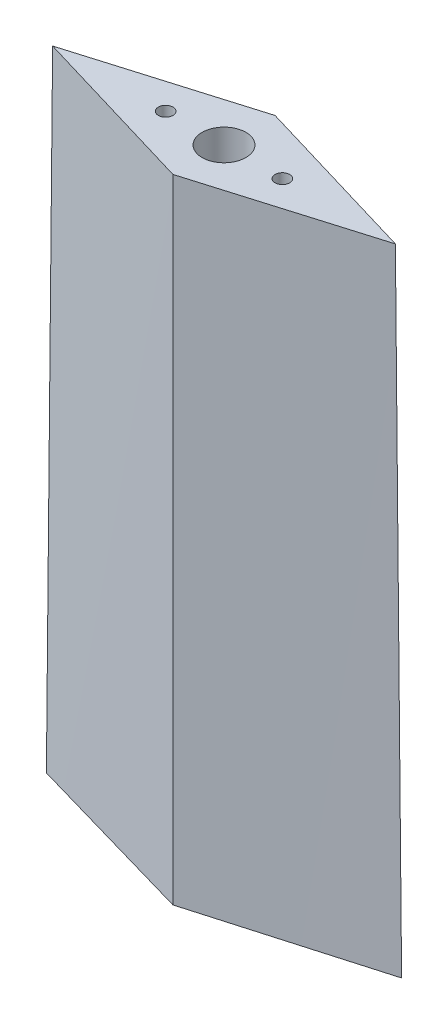
ISO-10303-21;
HEADER;
FILE_DESCRIPTION(('STEP AP214'),'2;1');
FILE_NAME('part.step','',(''),(''),'','','');
FILE_SCHEMA(('AUTOMOTIVE_DESIGN { 1 0 10303 214 1 1 1 1 }'));
ENDSEC;
DATA;
#1=APPLICATION_CONTEXT('core data for automotive mechanical design processes');
#2=APPLICATION_PROTOCOL_DEFINITION('international standard','automotive_design',2000,#1);
#3=PRODUCT_CONTEXT('',#1,'mechanical');
#4=PRODUCT('Part','Part','',(#3));
#5=PRODUCT_RELATED_PRODUCT_CATEGORY('part','',(#4));
#6=PRODUCT_DEFINITION_FORMATION('','',#4);
#7=PRODUCT_DEFINITION_CONTEXT('part definition',#1,'design');
#8=PRODUCT_DEFINITION('design','',#6,#7);
#9=PRODUCT_DEFINITION_SHAPE('','',#8);
#10=(LENGTH_UNIT() NAMED_UNIT(*) SI_UNIT(.MILLI.,.METRE.));
#11=(NAMED_UNIT(*) PLANE_ANGLE_UNIT() SI_UNIT($,.RADIAN.));
#12=(NAMED_UNIT(*) SI_UNIT($,.STERADIAN.) SOLID_ANGLE_UNIT());
#13=UNCERTAINTY_MEASURE_WITH_UNIT(LENGTH_MEASURE(1.E-05),#10,'distance_accuracy_value','');
#14=(GEOMETRIC_REPRESENTATION_CONTEXT(3) GLOBAL_UNCERTAINTY_ASSIGNED_CONTEXT((#13)) GLOBAL_UNIT_ASSIGNED_CONTEXT((#10,
#11,#12)) REPRESENTATION_CONTEXT('',''));
#15=CARTESIAN_POINT('',(0.,0.,0.));
#16=DIRECTION('',(0.,0.,1.));
#17=DIRECTION('',(1.,0.,0.));
#18=AXIS2_PLACEMENT_3D('',#15,#16,#17);
#19=CARTESIAN_POINT('',(142.421230690097,465.168027231046,-11.1125));
#20=DIRECTION('',(0.,-1.,0.));
#21=DIRECTION('',(0.,0.,-1.));
#22=AXIS2_PLACEMENT_3D('',#19,#20,#21);
#23=PLANE('',#22);
#24=CARTESIAN_POINT('',(193.768628680817,465.168027231046,0.));
#25=DIRECTION('',(0.,-1.,0.));
#26=DIRECTION('',(0.,0.,-1.));
#27=AXIS2_PLACEMENT_3D('',#24,#25,#26);
#28=CIRCLE('',#27,1.58749999999999);
#29=CARTESIAN_POINT('',(193.768628680817,465.168027231046,-1.58749999999999));
#30=VERTEX_POINT('',#29);
#31=EDGE_CURVE('E219',#30,#30,#28,.T.);
#32=ORIENTED_EDGE('',*,*,#31,.F.);
#33=EDGE_LOOP('',(#32));
#34=FACE_BOUND('',#33,.T.);
#35=CARTESIAN_POINT('',(168.368628680817,465.168027231046,0.));
#36=DIRECTION('',(0.,-1.,0.));
#37=DIRECTION('',(0.,0.,-1.));
#38=AXIS2_PLACEMENT_3D('',#35,#36,#37);
#39=CIRCLE('',#38,1.58749999999999);
#40=CARTESIAN_POINT('',(168.368628680817,465.168027231046,-1.58749999999999));
#41=VERTEX_POINT('',#40);
#42=EDGE_CURVE('E223',#41,#41,#39,.T.);
#43=ORIENTED_EDGE('',*,*,#42,.F.);
#44=EDGE_LOOP('',(#43));
#45=FACE_BOUND('',#44,.T.);
#46=CARTESIAN_POINT('',(181.068628680817,465.168027231046,0.));
#47=DIRECTION('',(0.,-1.,0.));
#48=DIRECTION('',(0.,0.,-1.));
#49=AXIS2_PLACEMENT_3D('',#46,#47,#48);
#50=CIRCLE('',#49,4.76250000000001);
#51=CARTESIAN_POINT('',(181.068628680817,465.168027231046,-4.76250000000001));
#52=VERTEX_POINT('',#51);
#53=EDGE_CURVE('E145',#52,#52,#50,.T.);
#54=ORIENTED_EDGE('',*,*,#53,.F.);
#55=EDGE_LOOP('',(#54));
#56=FACE_BOUND('',#55,.T.);
#57=DIRECTION('',(0.96106023622245,0.,0.276338962783115));
#58=VECTOR('',#57,1.);
#59=CARTESIAN_POINT('',(181.068628680817,465.168027231046,-11.1125));
#60=LINE('',#59,#58);
#61=CARTESIAN_POINT('',(181.068628680817,465.168027231046,-11.1125));
#62=VERTEX_POINT('',#61);
#63=CARTESIAN_POINT('',(219.716026671538,465.168027231046,0.));
#64=VERTEX_POINT('',#63);
#65=EDGE_CURVE('E120',#62,#64,#60,.T.);
#66=ORIENTED_EDGE('',*,*,#65,.T.);
#67=DIRECTION('',(0.96106023622245,0.,-0.276338962783115));
#68=VECTOR('',#67,1.);
#69=CARTESIAN_POINT('',(181.068628680817,465.168027231046,11.1125));
#70=LINE('',#69,#68);
#71=CARTESIAN_POINT('',(181.068628680817,465.168027231046,11.1125));
#72=VERTEX_POINT('',#71);
#73=EDGE_CURVE('E69',#72,#64,#70,.T.);
#74=ORIENTED_EDGE('',*,*,#73,.F.);
#75=DIRECTION('',(0.96106023622245,0.,0.276338962783115));
#76=VECTOR('',#75,1.);
#77=CARTESIAN_POINT('',(142.421230690097,465.168027231046,0.));
#78=LINE('',#77,#76);
#79=CARTESIAN_POINT('',(142.421230690097,465.168027231046,0.));
#80=VERTEX_POINT('',#79);
#81=EDGE_CURVE('E12',#80,#72,#78,.T.);
#82=ORIENTED_EDGE('',*,*,#81,.F.);
#83=DIRECTION('',(0.96106023622245,0.,-0.276338962783115));
#84=VECTOR('',#83,1.);
#85=CARTESIAN_POINT('',(142.421230690097,465.168027231046,0.));
#86=LINE('',#85,#84);
#87=EDGE_CURVE('E116',#80,#62,#86,.T.);
#88=ORIENTED_EDGE('',*,*,#87,.T.);
#89=EDGE_LOOP('',(#66,#74,#82,#88));
#90=FACE_BOUND('',#89,.T.);
#91=ADVANCED_FACE('F61',(#34,#45,#56,#90),#23,.T.);
#92=CARTESIAN_POINT('',(219.716026671538,465.168027231046,0.));
#93=CARTESIAN_POINT('',(213.502471629307,1096.96763455169,0.));
#94=CARTESIAN_POINT('',(213.274793673085,465.168027231046,1.85208333333331));
#95=CARTESIAN_POINT('',(208.096831137892,1096.96763455169,1.85208333333331));
#96=CARTESIAN_POINT('',(206.833560674631,465.168027231046,3.70416666666664));
#97=CARTESIAN_POINT('',(202.691190646477,1096.96763455169,3.70416666666663));
#98=CARTESIAN_POINT('',(193.951094677724,465.168027231046,7.4083333333333));
#99=CARTESIAN_POINT('',(191.879909663647,1096.96763455169,7.4083333333333));
#100=CARTESIAN_POINT('',(187.509861679271,465.168027231046,9.26041666666665));
#101=CARTESIAN_POINT('',(186.474269172232,1096.96763455169,9.26041666666665));
#102=CARTESIAN_POINT('',(181.068628680817,465.168027231046,11.1125));
#103=CARTESIAN_POINT('',(181.068628680817,1096.96763455169,11.1125));
#104=B_SPLINE_SURFACE_WITH_KNOTS('',3,1,((#92,#93),(#94,#95),(#96,#97),(#98,#99),(#100,#101),
(#102,#103)),.UNSPECIFIED.,.F.,.F.,.F.,(4,2,4),(2,2),(0.,0.5,1.),(0.,1.),.UNSPECIFIED.);
#105=DIRECTION('',(-0.00983421721197636,0.99995164291671,0.));
#106=VECTOR('',#105,1.);
#107=CARTESIAN_POINT('',(219.716026671538,465.168027231046,0.));
#108=LINE('',#107,#106);
#109=CARTESIAN_POINT('',(218.362092496898,602.837215652406,0.));
#110=VERTEX_POINT('',#109);
#111=EDGE_CURVE('E118',#64,#110,#108,.T.);
#112=CARTESIAN_POINT('',(218.362092496898,602.837215652406,0.));
#113=CARTESIAN_POINT('',(215.15052846194,602.837215652406,0.956964081279098));
#114=CARTESIAN_POINT('',(211.938964426982,602.837215652406,1.9139281625582));
#115=CARTESIAN_POINT('',(205.515836357066,602.837215652406,3.82785632511641));
#116=CARTESIAN_POINT('',(202.304272322108,602.837215652406,4.78482040639551));
#117=CARTESIAN_POINT('',(193.084681751706,602.837215652406,7.53202299178308));
#118=CARTESIAN_POINT('',(187.076655216262,602.837215652406,9.32226149589155));
#119=CARTESIAN_POINT('',(181.068628680818,602.837215652406,11.1125));
#120=B_SPLINE_CURVE_WITH_KNOTS('',3,(#112,#113,#114,#115,#116,#117,#118,#119),.UNSPECIFIED.,.F.,
.F.,(4,2,2,4),(0.,10.0533235415682,20.1066470831364,38.9138805524626),.UNSPECIFIED.);
#121=CARTESIAN_POINT('',(181.068628680817,602.837215652406,11.1125));
#122=VERTEX_POINT('',#121);
#123=EDGE_CURVE('E112',#110,#122,#120,.T.);
#124=DIRECTION('',(0.,1.,0.));
#125=VECTOR('',#124,1.);
#126=CARTESIAN_POINT('',(181.068628680817,781.067830891368,11.1125));
#127=LINE('',#126,#125);
#128=EDGE_CURVE('E111',#72,#122,#127,.T.);
#129=ORIENTED_EDGE('',*,*,#111,.T.);
#130=ORIENTED_EDGE('',*,*,#123,.T.);
#131=ORIENTED_EDGE('',*,*,#128,.F.);
#132=ORIENTED_EDGE('',*,*,#73,.T.);
#133=EDGE_LOOP('',(#129,#130,#131,#132));
#134=FACE_BOUND('',#133,.T.);
#135=ADVANCED_FACE('F162',(#134),#104,.F.);
#136=CARTESIAN_POINT('',(181.068628680817,465.168027231046,11.1125));
#137=CARTESIAN_POINT('',(181.068628680817,1096.96763455169,11.1125));
#138=CARTESIAN_POINT('',(174.627395682364,465.168027231046,9.26041666666668));
#139=CARTESIAN_POINT('',(175.662988189402,1096.96763455169,9.26041666666663));
#140=CARTESIAN_POINT('',(168.186162683911,465.168027231046,7.40833333333335));
#141=CARTESIAN_POINT('',(170.257347697988,1096.96763455169,7.40833333333328));
#142=CARTESIAN_POINT('',(155.303696687004,465.168027231046,3.70416666666668));
#143=CARTESIAN_POINT('',(159.446066715158,1096.96763455169,3.70416666666661));
#144=CARTESIAN_POINT('',(148.86246368855,465.168027231046,1.85208333333334));
#145=CARTESIAN_POINT('',(154.040426223743,1096.96763455169,1.8520833333333));
#146=CARTESIAN_POINT('',(142.421230690097,465.168027231046,0.));
#147=CARTESIAN_POINT('',(148.634785732328,1096.96763455169,0.));
#148=B_SPLINE_SURFACE_WITH_KNOTS('',3,1,((#136,#137),(#138,#139),(#140,#141),(#142,#143),(#144,
#145),(#146,#147)),.UNSPECIFIED.,.F.,.F.,.F.,(4,2,4),(2,2),(0.,0.5,1.),(0.,1.),.UNSPECIFIED.);
#149=CARTESIAN_POINT('',(181.068628680817,602.837215652406,11.1125));
#150=CARTESIAN_POINT('',(177.857064645859,602.837215652406,10.1555359187209));
#151=CARTESIAN_POINT('',(174.645500610901,602.837215652406,9.19857183744178));
#152=CARTESIAN_POINT('',(168.222372540985,602.837215652406,7.28464367488359));
#153=CARTESIAN_POINT('',(165.010808506027,602.837215652406,6.3276795936045));
#154=CARTESIAN_POINT('',(155.791217935625,602.837215652406,3.58047700821695));
#155=CARTESIAN_POINT('',(149.783191400181,602.837215652406,1.79023850410849));
#156=CARTESIAN_POINT('',(143.775164864737,602.837215652406,0.));
#157=B_SPLINE_CURVE_WITH_KNOTS('',3,(#149,#150,#151,#152,#153,#154,#155,#156),.UNSPECIFIED.,.F.,
.F.,(4,2,2,4),(0.,10.0533235415681,20.1066470831362,38.9138805524626),.UNSPECIFIED.);
#158=CARTESIAN_POINT('',(143.775164864737,602.837215652406,0.));
#159=VERTEX_POINT('',#158);
#160=EDGE_CURVE('E103',#122,#159,#157,.T.);
#161=DIRECTION('',(0.00983421721197636,0.99995164291671,0.));
#162=VECTOR('',#161,1.);
#163=CARTESIAN_POINT('',(145.528008211213,781.067830891368,0.));
#164=LINE('',#163,#162);
#165=EDGE_CURVE('E110',#80,#159,#164,.T.);
#166=ORIENTED_EDGE('',*,*,#128,.T.);
#167=ORIENTED_EDGE('',*,*,#160,.T.);
#168=ORIENTED_EDGE('',*,*,#165,.F.);
#169=ORIENTED_EDGE('',*,*,#81,.T.);
#170=EDGE_LOOP('',(#166,#167,#168,#169));
#171=FACE_BOUND('',#170,.T.);
#172=ADVANCED_FACE('F109',(#171),#148,.F.);
#173=CARTESIAN_POINT('',(219.716026671538,465.168027231046,0.));
#174=CARTESIAN_POINT('',(213.502471629307,1096.96763455169,0.));
#175=CARTESIAN_POINT('',(213.274793673085,465.168027231046,-1.85208333333331));
#176=CARTESIAN_POINT('',(208.096831137892,1096.96763455169,-1.85208333333331));
#177=CARTESIAN_POINT('',(206.833560674631,465.168027231046,-3.70416666666664));
#178=CARTESIAN_POINT('',(202.691190646477,1096.96763455169,-3.70416666666663));
#179=CARTESIAN_POINT('',(193.951094677724,465.168027231046,-7.4083333333333));
#180=CARTESIAN_POINT('',(191.879909663647,1096.96763455169,-7.4083333333333));
#181=CARTESIAN_POINT('',(187.509861679271,465.168027231046,-9.26041666666665));
#182=CARTESIAN_POINT('',(186.474269172232,1096.96763455169,-9.26041666666665));
#183=CARTESIAN_POINT('',(181.068628680817,465.168027231046,-11.1125));
#184=CARTESIAN_POINT('',(181.068628680817,1096.96763455169,-11.1125));
#185=B_SPLINE_SURFACE_WITH_KNOTS('',3,1,((#173,#174),(#175,#176),(#177,#178),(#179,#180),(#181,
#182),(#183,#184)),.UNSPECIFIED.,.F.,.F.,.F.,(4,2,4),(2,2),(0.,0.5,1.),(0.,1.),.UNSPECIFIED.);
#186=DIRECTION('',(0.,1.,0.));
#187=VECTOR('',#186,1.);
#188=CARTESIAN_POINT('',(181.068628680817,781.067830891368,-11.1125));
#189=LINE('',#188,#187);
#190=CARTESIAN_POINT('',(181.068628680817,602.837215652406,-11.1125));
#191=VERTEX_POINT('',#190);
#192=EDGE_CURVE('E140',#62,#191,#189,.T.);
#193=CARTESIAN_POINT('',(181.068628680817,602.837215652406,-11.1125));
#194=CARTESIAN_POINT('',(184.280192715776,602.837215652406,-10.1555359187209));
#195=CARTESIAN_POINT('',(187.491756750734,602.837215652406,-9.19857183744179));
#196=CARTESIAN_POINT('',(193.91488482065,602.837215652406,-7.28464367488358));
#197=CARTESIAN_POINT('',(197.126448855608,602.837215652406,-6.32767959360448));
#198=CARTESIAN_POINT('',(206.34603942601,602.837215652406,-3.58047700821691));
#199=CARTESIAN_POINT('',(212.354065961454,602.837215652406,-1.79023850410845));
#200=CARTESIAN_POINT('',(218.362092496898,602.837215652406,0.));
#201=B_SPLINE_CURVE_WITH_KNOTS('',3,(#193,#194,#195,#196,#197,#198,#199,#200),.UNSPECIFIED.,.F.,
.F.,(4,2,2,4),(0.,10.0533235415682,20.1066470831363,38.9138805524626),.UNSPECIFIED.);
#202=EDGE_CURVE('E77',#191,#110,#201,.T.);
#203=ORIENTED_EDGE('',*,*,#192,.T.);
#204=ORIENTED_EDGE('',*,*,#202,.T.);
#205=ORIENTED_EDGE('',*,*,#111,.F.);
#206=ORIENTED_EDGE('',*,*,#65,.F.);
#207=EDGE_LOOP('',(#203,#204,#205,#206));
#208=FACE_BOUND('',#207,.T.);
#209=ADVANCED_FACE('F186',(#208),#185,.T.);
#210=CARTESIAN_POINT('',(181.068628680817,465.168027231046,-11.1125));
#211=CARTESIAN_POINT('',(181.068628680817,1096.96763455169,-11.1125));
#212=CARTESIAN_POINT('',(174.627395682364,465.168027231046,-9.26041666666668));
#213=CARTESIAN_POINT('',(175.662988189402,1096.96763455169,-9.26041666666663));
#214=CARTESIAN_POINT('',(168.186162683911,465.168027231046,-7.40833333333335));
#215=CARTESIAN_POINT('',(170.257347697988,1096.96763455169,-7.40833333333328));
#216=CARTESIAN_POINT('',(155.303696687004,465.168027231046,-3.70416666666668));
#217=CARTESIAN_POINT('',(159.446066715158,1096.96763455169,-3.70416666666661));
#218=CARTESIAN_POINT('',(148.86246368855,465.168027231046,-1.85208333333334));
#219=CARTESIAN_POINT('',(154.040426223743,1096.96763455169,-1.8520833333333));
#220=CARTESIAN_POINT('',(142.421230690097,465.168027231046,0.));
#221=CARTESIAN_POINT('',(148.634785732328,1096.96763455169,0.));
#222=B_SPLINE_SURFACE_WITH_KNOTS('',3,1,((#210,#211),(#212,#213),(#214,#215),(#216,#217),(#218,
#219),(#220,#221)),.UNSPECIFIED.,.F.,.F.,.F.,(4,2,4),(2,2),(0.,0.5,1.),(0.,1.),.UNSPECIFIED.);
#223=CARTESIAN_POINT('',(143.775164864737,602.837215652406,0.));
#224=CARTESIAN_POINT('',(146.986728899695,602.837215652406,-0.956964081279093));
#225=CARTESIAN_POINT('',(150.198292934653,602.837215652406,-1.91392816255819));
#226=CARTESIAN_POINT('',(156.621421004569,602.837215652406,-3.8278563251164));
#227=CARTESIAN_POINT('',(159.832985039527,602.837215652406,-4.7848204063955));
#228=CARTESIAN_POINT('',(169.052575609929,602.837215652406,-7.53202299178308));
#229=CARTESIAN_POINT('',(175.060602145373,602.837215652406,-9.32226149589155));
#230=CARTESIAN_POINT('',(181.068628680818,602.837215652406,-11.1125));
#231=B_SPLINE_CURVE_WITH_KNOTS('',3,(#223,#224,#225,#226,#227,#228,#229,#230),.UNSPECIFIED.,.F.,
.F.,(4,2,2,4),(0.,10.0533235415681,20.1066470831363,38.9138805524626),.UNSPECIFIED.);
#232=EDGE_CURVE('E100',#159,#191,#231,.T.);
#233=ORIENTED_EDGE('',*,*,#165,.T.);
#234=ORIENTED_EDGE('',*,*,#232,.T.);
#235=ORIENTED_EDGE('',*,*,#192,.F.);
#236=ORIENTED_EDGE('',*,*,#87,.F.);
#237=EDGE_LOOP('',(#233,#234,#235,#236));
#238=FACE_BOUND('',#237,.T.);
#239=ADVANCED_FACE('F114',(#238),#222,.T.);
#240=CARTESIAN_POINT('',(181.068628680817,1100.16802723105,0.));
#241=DIRECTION('',(0.,-1.,0.));
#242=DIRECTION('',(0.,0.,-1.));
#243=AXIS2_PLACEMENT_3D('',#240,#241,#242);
#244=CYLINDRICAL_SURFACE('',#243,4.76250000000001);
#245=CARTESIAN_POINT('',(181.068628680817,602.837215652406,0.));
#246=DIRECTION('',(0.,-1.,0.));
#247=DIRECTION('',(0.,0.,-1.));
#248=AXIS2_PLACEMENT_3D('',#245,#246,#247);
#249=CIRCLE('',#248,4.76250000000001);
#250=CARTESIAN_POINT('',(181.068628680817,602.837215652406,-4.76250000000001));
#251=VERTEX_POINT('',#250);
#252=EDGE_CURVE('E64',#251,#251,#249,.F.);
#253=CARTESIAN_POINT('',(181.068628680817,602.837215652406,-4.76250000000001));
#254=CARTESIAN_POINT('',(181.068628680817,601.40316160635,-4.76250000000001));
#255=CARTESIAN_POINT('',(181.068628680817,599.969107560295,-4.76250000000001));
#256=CARTESIAN_POINT('',(181.068628680817,597.100999468183,-4.76250000000001));
#257=CARTESIAN_POINT('',(181.068628680817,595.666945422127,-4.76250000000001));
#258=CARTESIAN_POINT('',(181.068628680817,592.798837330015,-4.76250000000001));
#259=CARTESIAN_POINT('',(181.068628680817,591.364783283959,-4.76250000000001));
#260=CARTESIAN_POINT('',(181.068628680817,588.496675191848,-4.76250000000001));
#261=CARTESIAN_POINT('',(181.068628680817,587.062621145792,-4.76250000000001));
#262=CARTESIAN_POINT('',(181.068628680817,584.19451305368,-4.76250000000001));
#263=CARTESIAN_POINT('',(181.068628680817,582.760459007624,-4.76250000000001));
#264=CARTESIAN_POINT('',(181.068628680817,579.892350915513,-4.76250000000001));
#265=CARTESIAN_POINT('',(181.068628680817,578.458296869457,-4.76250000000001));
#266=CARTESIAN_POINT('',(181.068628680817,575.590188777345,-4.76250000000001));
#267=CARTESIAN_POINT('',(181.068628680817,574.15613473129,-4.76250000000001));
#268=CARTESIAN_POINT('',(181.068628680817,571.288026639178,-4.76250000000001));
#269=CARTESIAN_POINT('',(181.068628680817,569.853972593122,-4.76250000000001));
#270=CARTESIAN_POINT('',(181.068628680817,566.98586450101,-4.76250000000001));
#271=CARTESIAN_POINT('',(181.068628680817,565.551810454955,-4.76250000000001));
#272=CARTESIAN_POINT('',(181.068628680817,562.683702362843,-4.76250000000001));
#273=CARTESIAN_POINT('',(181.068628680817,561.249648316787,-4.76250000000001));
#274=CARTESIAN_POINT('',(181.068628680817,558.381540224675,-4.76250000000001));
#275=CARTESIAN_POINT('',(181.068628680817,556.947486178619,-4.76250000000001));
#276=CARTESIAN_POINT('',(181.068628680817,554.079378086508,-4.76250000000001));
#277=CARTESIAN_POINT('',(181.068628680817,552.645324040452,-4.76250000000001));
#278=CARTESIAN_POINT('',(181.068628680817,549.77721594834,-4.76250000000001));
#279=CARTESIAN_POINT('',(181.068628680817,548.343161902284,-4.76250000000001));
#280=CARTESIAN_POINT('',(181.068628680817,545.475053810173,-4.76250000000001));
#281=CARTESIAN_POINT('',(181.068628680817,544.040999764117,-4.76250000000001));
#282=CARTESIAN_POINT('',(181.068628680817,541.172891672005,-4.76250000000001));
#283=CARTESIAN_POINT('',(181.068628680817,539.738837625949,-4.76250000000001));
#284=CARTESIAN_POINT('',(181.068628680817,536.870729533838,-4.76250000000001));
#285=CARTESIAN_POINT('',(181.068628680817,535.436675487782,-4.76250000000001));
#286=CARTESIAN_POINT('',(181.068628680817,532.56856739567,-4.76250000000001));
#287=CARTESIAN_POINT('',(181.068628680817,531.134513349614,-4.76250000000001));
#288=CARTESIAN_POINT('',(181.068628680817,528.266405257503,-4.76250000000001));
#289=CARTESIAN_POINT('',(181.068628680817,526.832351211447,-4.76250000000001));
#290=CARTESIAN_POINT('',(181.068628680817,523.964243119335,-4.76250000000001));
#291=CARTESIAN_POINT('',(181.068628680817,522.530189073279,-4.76250000000001));
#292=CARTESIAN_POINT('',(181.068628680817,519.662080981168,-4.76250000000001));
#293=CARTESIAN_POINT('',(181.068628680817,518.228026935112,-4.76250000000001));
#294=CARTESIAN_POINT('',(181.068628680817,515.359918843,-4.76250000000001));
#295=CARTESIAN_POINT('',(181.068628680817,513.925864796944,-4.76250000000001));
#296=CARTESIAN_POINT('',(181.068628680817,511.057756704833,-4.76250000000001));
#297=CARTESIAN_POINT('',(181.068628680817,509.623702658777,-4.76250000000001));
#298=CARTESIAN_POINT('',(181.068628680817,506.755594566665,-4.76250000000001));
#299=CARTESIAN_POINT('',(181.068628680817,505.321540520609,-4.76250000000001));
#300=CARTESIAN_POINT('',(181.068628680817,502.453432428498,-4.76250000000001));
#301=CARTESIAN_POINT('',(181.068628680817,501.019378382442,-4.76250000000001));
#302=CARTESIAN_POINT('',(181.068628680817,498.15127029033,-4.76250000000001));
#303=CARTESIAN_POINT('',(181.068628680817,496.717216244274,-4.76250000000001));
#304=CARTESIAN_POINT('',(181.068628680817,493.849108152163,-4.76250000000001));
#305=CARTESIAN_POINT('',(181.068628680817,492.415054106107,-4.76250000000001));
#306=CARTESIAN_POINT('',(181.068628680817,489.546946013995,-4.76250000000001));
#307=CARTESIAN_POINT('',(181.068628680817,488.112891967939,-4.76250000000001));
#308=CARTESIAN_POINT('',(181.068628680817,485.244783875828,-4.76250000000001));
#309=CARTESIAN_POINT('',(181.068628680817,483.810729829772,-4.76250000000001));
#310=CARTESIAN_POINT('',(181.068628680817,480.94262173766,-4.76250000000001));
#311=CARTESIAN_POINT('',(181.068628680817,479.508567691604,-4.76250000000001));
#312=CARTESIAN_POINT('',(181.068628680817,476.640459599493,-4.76250000000001));
#313=CARTESIAN_POINT('',(181.068628680817,475.206405553437,-4.76250000000001));
#314=CARTESIAN_POINT('',(181.068628680817,472.338297461325,-4.76250000000001));
#315=CARTESIAN_POINT('',(181.068628680817,470.904243415269,-4.76250000000001));
#316=CARTESIAN_POINT('',(181.068628680817,468.036135323158,-4.76250000000001));
#317=CARTESIAN_POINT('',(181.068628680817,466.602081277102,-4.76250000000001));
#318=CARTESIAN_POINT('',(181.068628680817,465.168027231046,-4.76250000000001));
#319=B_SPLINE_CURVE_WITH_KNOTS('',3,(#253,#254,#255,#256,#257,#258,#259,#260,#261,#262,#263,
#264,#265,#266,#267,#268,#269,#270,#271,#272,#273,#274,#275,#276,#277,#278,#279,#280,#281,#282,
#283,#284,#285,#286,#287,#288,#289,#290,#291,#292,#293,#294,#295,#296,#297,#298,#299,#300,#301,
#302,#303,#304,#305,#306,#307,#308,#309,#310,#311,#312,#313,#314,#315,#316,#317,#318),
.UNSPECIFIED.,.F.,.F.,(4,2,2,2,2,2,2,2,2,2,2,2,2,2,2,2,2,2,2,2,2,2,2,2,2,2,2,2,2,2,2,2,4),(0.,
4.30216213816748,8.60432427633506,12.9064864145025,17.20864855267,21.5108106908375,
25.8129728290051,30.1151349671726,34.41729710534,38.7194592435075,43.0216213816751,
47.3237835198426,51.62594565801,55.9281077961776,60.2302699343451,64.5324320725126,
68.8345942106802,73.1367563488476,77.4389184870151,81.7410806251826,86.0432427633502,
90.3454049015177,94.6475670396851,98.9497291778526,103.25189131602,107.554053454188,
111.856215592355,116.158377730523,120.46053986869,124.762702006858,129.064864145025,
133.367026283193,137.66918842136),.UNSPECIFIED.);
#320=EDGE_CURVE('BSEAM172',#251,#52,#319,.T.);
#321=ORIENTED_EDGE('',*,*,#252,.T.);
#322=ORIENTED_EDGE('',*,*,#53,.T.);
#323=ORIENTED_EDGE('',*,*,#320,.T.);
#324=ORIENTED_EDGE('',*,*,#320,.F.);
#325=EDGE_LOOP('',(#321,#323,#322,#324));
#326=FACE_BOUND('',#325,.T.);
#327=ADVANCED_FACE('F172',(#326),#244,.F.);
#328=CARTESIAN_POINT('',(0.,602.837215652406,-11.1126));
#329=DIRECTION('',(0.,-1.,0.));
#330=DIRECTION('',(0.,0.,-1.));
#331=AXIS2_PLACEMENT_3D('',#328,#329,#330);
#332=PLANE('',#331);
#333=CARTESIAN_POINT('',(193.768628680817,602.837215652406,0.));
#334=DIRECTION('',(0.,1.,0.));
#335=DIRECTION('',(0.,0.,1.));
#336=AXIS2_PLACEMENT_3D('',#333,#334,#335);
#337=CIRCLE('',#336,1.58749999999999);
#338=CARTESIAN_POINT('',(193.768628680817,602.837215652406,1.58749999999999));
#339=VERTEX_POINT('',#338);
#340=EDGE_CURVE('E242',#339,#339,#337,.T.);
#341=ORIENTED_EDGE('',*,*,#340,.F.);
#342=EDGE_LOOP('',(#341));
#343=FACE_BOUND('',#342,.T.);
#344=CARTESIAN_POINT('',(168.368628680817,602.837215652406,0.));
#345=DIRECTION('',(0.,1.,0.));
#346=DIRECTION('',(0.,0.,1.));
#347=AXIS2_PLACEMENT_3D('',#344,#345,#346);
#348=CIRCLE('',#347,1.58749999999999);
#349=CARTESIAN_POINT('',(168.368628680817,602.837215652406,1.58749999999999));
#350=VERTEX_POINT('',#349);
#351=EDGE_CURVE('E236',#350,#350,#348,.T.);
#352=ORIENTED_EDGE('',*,*,#351,.F.);
#353=EDGE_LOOP('',(#352));
#354=FACE_BOUND('',#353,.T.);
#355=ORIENTED_EDGE('',*,*,#252,.F.);
#356=EDGE_LOOP('',(#355));
#357=FACE_BOUND('',#356,.T.);
#358=ORIENTED_EDGE('',*,*,#202,.F.);
#359=ORIENTED_EDGE('',*,*,#232,.F.);
#360=ORIENTED_EDGE('',*,*,#160,.F.);
#361=ORIENTED_EDGE('',*,*,#123,.F.);
#362=EDGE_LOOP('',(#358,#359,#360,#361));
#363=FACE_BOUND('',#362,.T.);
#364=ADVANCED_FACE('F102',(#343,#354,#357,#363),#332,.F.);
#365=CARTESIAN_POINT('',(168.368628680817,477.868027231046,0.));
#366=DIRECTION('',(0.,-1.,0.));
#367=DIRECTION('',(0.,0.,-1.));
#368=AXIS2_PLACEMENT_3D('',#365,#366,#367);
#369=CYLINDRICAL_SURFACE('',#368,1.58749999999999);
#370=CARTESIAN_POINT('',(168.368628680817,477.868027231046,0.));
#371=DIRECTION('',(0.,-1.,0.));
#372=DIRECTION('',(0.,0.,-1.));
#373=AXIS2_PLACEMENT_3D('',#370,#371,#372);
#374=CIRCLE('',#373,1.58749999999999);
#375=CARTESIAN_POINT('',(168.368628680817,477.868027231046,-1.58749999999999));
#376=VERTEX_POINT('',#375);
#377=EDGE_CURVE('E227',#376,#376,#374,.T.);
#378=ORIENTED_EDGE('',*,*,#377,.F.);
#379=EDGE_LOOP('',(#378));
#380=FACE_BOUND('',#379,.T.);
#381=ORIENTED_EDGE('',*,*,#42,.T.);
#382=EDGE_LOOP('',(#381));
#383=FACE_BOUND('',#382,.T.);
#384=ADVANCED_FACE('F171',(#380,#383),#369,.F.);
#385=CARTESIAN_POINT('',(168.368628680817,477.868027231046,0.));
#386=DIRECTION('',(0.,-1.,0.));
#387=DIRECTION('',(0.,0.,-1.));
#388=AXIS2_PLACEMENT_3D('',#385,#386,#387);
#389=PLANE('',#388);
#390=ORIENTED_EDGE('',*,*,#377,.T.);
#391=EDGE_LOOP('',(#390));
#392=FACE_BOUND('',#391,.T.);
#393=ADVANCED_FACE('F279',(#392),#389,.T.);
#394=CARTESIAN_POINT('',(193.768628680817,477.868027231046,0.));
#395=DIRECTION('',(0.,-1.,0.));
#396=DIRECTION('',(0.,0.,-1.));
#397=AXIS2_PLACEMENT_3D('',#394,#395,#396);
#398=CYLINDRICAL_SURFACE('',#397,1.58749999999999);
#399=CARTESIAN_POINT('',(193.768628680817,477.868027231046,0.));
#400=DIRECTION('',(0.,-1.,0.));
#401=DIRECTION('',(0.,0.,-1.));
#402=AXIS2_PLACEMENT_3D('',#399,#400,#401);
#403=CIRCLE('',#402,1.58749999999999);
#404=CARTESIAN_POINT('',(193.768628680817,477.868027231046,-1.58749999999999));
#405=VERTEX_POINT('',#404);
#406=EDGE_CURVE('E228',#405,#405,#403,.T.);
#407=ORIENTED_EDGE('',*,*,#406,.F.);
#408=EDGE_LOOP('',(#407));
#409=FACE_BOUND('',#408,.T.);
#410=ORIENTED_EDGE('',*,*,#31,.T.);
#411=EDGE_LOOP('',(#410));
#412=FACE_BOUND('',#411,.T.);
#413=ADVANCED_FACE('F273',(#409,#412),#398,.F.);
#414=CARTESIAN_POINT('',(193.768628680817,477.868027231046,0.));
#415=DIRECTION('',(0.,-1.,0.));
#416=DIRECTION('',(0.,0.,-1.));
#417=AXIS2_PLACEMENT_3D('',#414,#415,#416);
#418=PLANE('',#417);
#419=ORIENTED_EDGE('',*,*,#406,.T.);
#420=EDGE_LOOP('',(#419));
#421=FACE_BOUND('',#420,.T.);
#422=ADVANCED_FACE('F264',(#421),#418,.T.);
#423=CARTESIAN_POINT('',(168.368628680817,590.137215652406,0.));
#424=DIRECTION('',(0.,1.,0.));
#425=DIRECTION('',(0.,0.,1.));
#426=AXIS2_PLACEMENT_3D('',#423,#424,#425);
#427=CYLINDRICAL_SURFACE('',#426,1.58749999999999);
#428=CARTESIAN_POINT('',(168.368628680817,590.137215652406,0.));
#429=DIRECTION('',(0.,1.,0.));
#430=DIRECTION('',(0.,0.,1.));
#431=AXIS2_PLACEMENT_3D('',#428,#429,#430);
#432=CIRCLE('',#431,1.58749999999999);
#433=CARTESIAN_POINT('',(168.368628680817,590.137215652406,1.58749999999999));
#434=VERTEX_POINT('',#433);
#435=EDGE_CURVE('E234',#434,#434,#432,.T.);
#436=ORIENTED_EDGE('',*,*,#435,.F.);
#437=EDGE_LOOP('',(#436));
#438=FACE_BOUND('',#437,.T.);
#439=ORIENTED_EDGE('',*,*,#351,.T.);
#440=EDGE_LOOP('',(#439));
#441=FACE_BOUND('',#440,.T.);
#442=ADVANCED_FACE('F262',(#438,#441),#427,.F.);
#443=CARTESIAN_POINT('',(168.368628680817,590.137215652406,0.));
#444=DIRECTION('',(0.,1.,0.));
#445=DIRECTION('',(0.,0.,1.));
#446=AXIS2_PLACEMENT_3D('',#443,#444,#445);
#447=PLANE('',#446);
#448=ORIENTED_EDGE('',*,*,#435,.T.);
#449=EDGE_LOOP('',(#448));
#450=FACE_BOUND('',#449,.T.);
#451=ADVANCED_FACE('F253',(#450),#447,.T.);
#452=CARTESIAN_POINT('',(193.768628680817,590.137215652406,0.));
#453=DIRECTION('',(0.,1.,0.));
#454=DIRECTION('',(0.,0.,1.));
#455=AXIS2_PLACEMENT_3D('',#452,#453,#454);
#456=CYLINDRICAL_SURFACE('',#455,1.58749999999999);
#457=CARTESIAN_POINT('',(193.768628680817,590.137215652406,0.));
#458=DIRECTION('',(0.,1.,0.));
#459=DIRECTION('',(0.,0.,1.));
#460=AXIS2_PLACEMENT_3D('',#457,#458,#459);
#461=CIRCLE('',#460,1.58749999999999);
#462=CARTESIAN_POINT('',(193.768628680817,590.137215652406,1.58749999999999));
#463=VERTEX_POINT('',#462);
#464=EDGE_CURVE('E239',#463,#463,#461,.T.);
#465=ORIENTED_EDGE('',*,*,#464,.F.);
#466=EDGE_LOOP('',(#465));
#467=FACE_BOUND('',#466,.T.);
#468=ORIENTED_EDGE('',*,*,#340,.T.);
#469=EDGE_LOOP('',(#468));
#470=FACE_BOUND('',#469,.T.);
#471=ADVANCED_FACE('F250',(#467,#470),#456,.F.);
#472=CARTESIAN_POINT('',(193.768628680817,590.137215652406,0.));
#473=DIRECTION('',(0.,1.,0.));
#474=DIRECTION('',(0.,0.,1.));
#475=AXIS2_PLACEMENT_3D('',#472,#473,#474);
#476=PLANE('',#475);
#477=ORIENTED_EDGE('',*,*,#464,.T.);
#478=EDGE_LOOP('',(#477));
#479=FACE_BOUND('',#478,.T.);
#480=ADVANCED_FACE('F248',(#479),#476,.T.);
#481=CLOSED_SHELL('',(#91,#135,#172,#209,#239,#327,#364,#384,#393,#413,#422,#442,#451,#471,#480));
#482=MANIFOLD_SOLID_BREP('B2',#481);
#483=ADVANCED_BREP_SHAPE_REPRESENTATION('',(#18,#482),#14);
#484=SHAPE_DEFINITION_REPRESENTATION(#9,#483);
ENDSEC;
END-ISO-10303-21;
